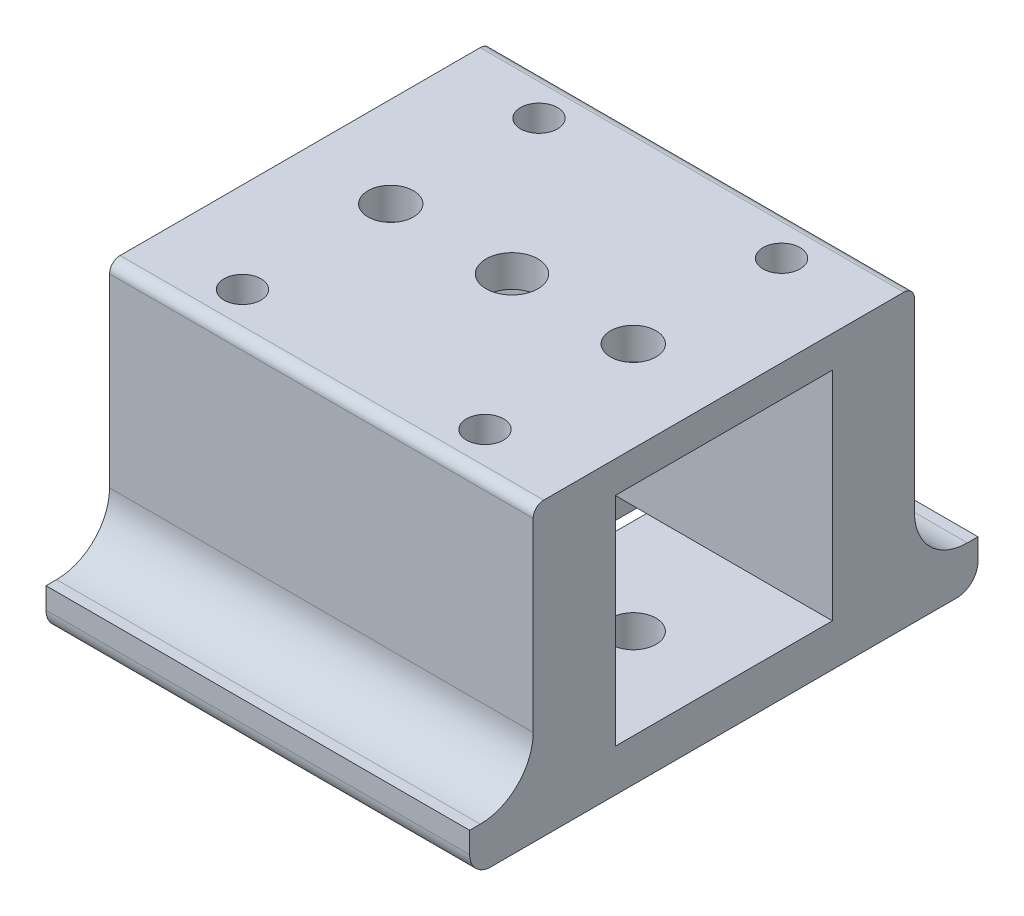
ISO-10303-21;
HEADER;
FILE_DESCRIPTION(('STEP AP214'),'2;1');
FILE_NAME('part.step','',(''),(''),'','','');
FILE_SCHEMA(('AUTOMOTIVE_DESIGN { 1 0 10303 214 1 1 1 1 }'));
ENDSEC;
DATA;
#1=APPLICATION_CONTEXT('core data for automotive mechanical design processes');
#2=APPLICATION_PROTOCOL_DEFINITION('international standard','automotive_design',2000,#1);
#3=PRODUCT_CONTEXT('',#1,'mechanical');
#4=PRODUCT('Part','Part','',(#3));
#5=PRODUCT_RELATED_PRODUCT_CATEGORY('part','',(#4));
#6=PRODUCT_DEFINITION_FORMATION('','',#4);
#7=PRODUCT_DEFINITION_CONTEXT('part definition',#1,'design');
#8=PRODUCT_DEFINITION('design','',#6,#7);
#9=PRODUCT_DEFINITION_SHAPE('','',#8);
#10=(LENGTH_UNIT() NAMED_UNIT(*) SI_UNIT(.MILLI.,.METRE.));
#11=(NAMED_UNIT(*) PLANE_ANGLE_UNIT() SI_UNIT($,.RADIAN.));
#12=(NAMED_UNIT(*) SI_UNIT($,.STERADIAN.) SOLID_ANGLE_UNIT());
#13=UNCERTAINTY_MEASURE_WITH_UNIT(LENGTH_MEASURE(1.E-05),#10,'distance_accuracy_value','');
#14=(GEOMETRIC_REPRESENTATION_CONTEXT(3) GLOBAL_UNCERTAINTY_ASSIGNED_CONTEXT((#13)) GLOBAL_UNIT_ASSIGNED_CONTEXT((#10,
#11,#12)) REPRESENTATION_CONTEXT('',''));
#15=CARTESIAN_POINT('',(0.,0.,0.));
#16=DIRECTION('',(0.,0.,1.));
#17=DIRECTION('',(1.,0.,0.));
#18=AXIS2_PLACEMENT_3D('',#15,#16,#17);
#19=CARTESIAN_POINT('',(0.,26.5,-17.));
#20=DIRECTION('',(-1.,0.,0.));
#21=DIRECTION('',(0.,0.,1.));
#22=AXIS2_PLACEMENT_3D('',#19,#20,#21);
#23=CYLINDRICAL_SURFACE('',#22,1.);
#24=DIRECTION('',(-1.,0.,0.));
#25=VECTOR('',#24,1.);
#26=CARTESIAN_POINT('',(0.,27.5,-17.));
#27=LINE('',#26,#25);
#28=CARTESIAN_POINT('',(20.,27.5,-17.));
#29=VERTEX_POINT('',#28);
#30=CARTESIAN_POINT('',(-20.,27.5,-17.));
#31=VERTEX_POINT('',#30);
#32=EDGE_CURVE('E451',#29,#31,#27,.T.);
#33=ORIENTED_EDGE('',*,*,#32,.F.);
#34=CARTESIAN_POINT('',(20.,26.5,-17.));
#35=DIRECTION('',(-1.,0.,0.));
#36=DIRECTION('',(0.,0.,1.));
#37=AXIS2_PLACEMENT_3D('',#34,#35,#36);
#38=CIRCLE('',#37,1.);
#39=CARTESIAN_POINT('',(20.,26.5,-18.));
#40=VERTEX_POINT('',#39);
#41=EDGE_CURVE('E55',#40,#29,#38,.F.);
#42=ORIENTED_EDGE('',*,*,#41,.F.);
#43=DIRECTION('',(-1.,0.,0.));
#44=VECTOR('',#43,1.);
#45=CARTESIAN_POINT('',(0.,26.5,-18.));
#46=LINE('',#45,#44);
#47=CARTESIAN_POINT('',(-20.,26.5,-18.));
#48=VERTEX_POINT('',#47);
#49=EDGE_CURVE('E455',#48,#40,#46,.F.);
#50=ORIENTED_EDGE('',*,*,#49,.F.);
#51=CARTESIAN_POINT('',(-20.,26.5,-17.));
#52=DIRECTION('',(-1.,0.,0.));
#53=DIRECTION('',(0.,0.,1.));
#54=AXIS2_PLACEMENT_3D('',#51,#52,#53);
#55=CIRCLE('',#54,1.);
#56=EDGE_CURVE('E11',#31,#48,#55,.T.);
#57=ORIENTED_EDGE('',*,*,#56,.F.);
#58=EDGE_LOOP('',(#33,#42,#50,#57));
#59=FACE_BOUND('',#58,.T.);
#60=ADVANCED_FACE('F46',(#59),#23,.T.);
#61=CARTESIAN_POINT('',(0.,26.5,17.));
#62=DIRECTION('',(-1.,0.,0.));
#63=DIRECTION('',(0.,0.,1.));
#64=AXIS2_PLACEMENT_3D('',#61,#62,#63);
#65=CYLINDRICAL_SURFACE('',#64,1.);
#66=DIRECTION('',(1.,0.,0.));
#67=VECTOR('',#66,1.);
#68=CARTESIAN_POINT('',(0.,27.5,17.));
#69=LINE('',#68,#67);
#70=CARTESIAN_POINT('',(-20.,27.5,17.));
#71=VERTEX_POINT('',#70);
#72=CARTESIAN_POINT('',(20.,27.5,17.));
#73=VERTEX_POINT('',#72);
#74=EDGE_CURVE('E436',#71,#73,#69,.T.);
#75=ORIENTED_EDGE('',*,*,#74,.F.);
#76=CARTESIAN_POINT('',(-20.,26.5,17.));
#77=DIRECTION('',(-1.,0.,0.));
#78=DIRECTION('',(0.,0.,1.));
#79=AXIS2_PLACEMENT_3D('',#76,#77,#78);
#80=CIRCLE('',#79,1.);
#81=CARTESIAN_POINT('',(-20.,26.5,18.));
#82=VERTEX_POINT('',#81);
#83=EDGE_CURVE('E444',#82,#71,#80,.T.);
#84=ORIENTED_EDGE('',*,*,#83,.F.);
#85=DIRECTION('',(1.,0.,0.));
#86=VECTOR('',#85,1.);
#87=CARTESIAN_POINT('',(0.,26.5,18.));
#88=LINE('',#87,#86);
#89=CARTESIAN_POINT('',(20.,26.5,18.));
#90=VERTEX_POINT('',#89);
#91=EDGE_CURVE('E440',#90,#82,#88,.F.);
#92=ORIENTED_EDGE('',*,*,#91,.F.);
#93=CARTESIAN_POINT('',(20.,26.5,17.));
#94=DIRECTION('',(-1.,0.,0.));
#95=DIRECTION('',(0.,0.,1.));
#96=AXIS2_PLACEMENT_3D('',#93,#94,#95);
#97=CIRCLE('',#96,1.);
#98=EDGE_CURVE('E448',#73,#90,#97,.F.);
#99=ORIENTED_EDGE('',*,*,#98,.F.);
#100=EDGE_LOOP('',(#75,#84,#92,#99));
#101=FACE_BOUND('',#100,.T.);
#102=ADVANCED_FACE('F551',(#101),#65,.T.);
#103=CARTESIAN_POINT('',(0.,27.5,0.));
#104=DIRECTION('',(0.,1.,0.));
#105=DIRECTION('',(0.,0.,1.));
#106=AXIS2_PLACEMENT_3D('',#103,#104,#105);
#107=PLANE('',#106);
#108=CARTESIAN_POINT('',(0.,27.5,0.));
#109=DIRECTION('',(0.,-1.,0.));
#110=DIRECTION('',(0.,0.,-1.));
#111=AXIS2_PLACEMENT_3D('',#108,#109,#110);
#112=CIRCLE('',#111,2.45);
#113=CARTESIAN_POINT('',(0.,27.5,-2.45));
#114=VERTEX_POINT('',#113);
#115=EDGE_CURVE('E525',#114,#114,#112,.T.);
#116=ORIENTED_EDGE('',*,*,#115,.T.);
#117=EDGE_LOOP('',(#116));
#118=FACE_BOUND('',#117,.T.);
#119=CARTESIAN_POINT('',(11.45,27.5,-14.));
#120=DIRECTION('',(0.,-1.,0.));
#121=DIRECTION('',(0.,0.,-1.));
#122=AXIS2_PLACEMENT_3D('',#119,#120,#121);
#123=CIRCLE('',#122,1.75);
#124=CARTESIAN_POINT('',(11.45,27.5,-15.75));
#125=VERTEX_POINT('',#124);
#126=EDGE_CURVE('E514',#125,#125,#123,.F.);
#127=ORIENTED_EDGE('',*,*,#126,.F.);
#128=EDGE_LOOP('',(#127));
#129=FACE_BOUND('',#128,.T.);
#130=CARTESIAN_POINT('',(11.45,27.5,14.));
#131=DIRECTION('',(0.,-1.,0.));
#132=DIRECTION('',(0.,0.,-1.));
#133=AXIS2_PLACEMENT_3D('',#130,#131,#132);
#134=CIRCLE('',#133,1.75);
#135=CARTESIAN_POINT('',(11.45,27.5,12.25));
#136=VERTEX_POINT('',#135);
#137=EDGE_CURVE('E503',#136,#136,#134,.F.);
#138=ORIENTED_EDGE('',*,*,#137,.F.);
#139=EDGE_LOOP('',(#138));
#140=FACE_BOUND('',#139,.T.);
#141=CARTESIAN_POINT('',(-11.45,27.5,-14.));
#142=DIRECTION('',(0.,-1.,0.));
#143=DIRECTION('',(0.,0.,-1.));
#144=AXIS2_PLACEMENT_3D('',#141,#142,#143);
#145=CIRCLE('',#144,1.75);
#146=CARTESIAN_POINT('',(-11.45,27.5,-15.75));
#147=VERTEX_POINT('',#146);
#148=EDGE_CURVE('E518',#147,#147,#145,.F.);
#149=ORIENTED_EDGE('',*,*,#148,.F.);
#150=EDGE_LOOP('',(#149));
#151=FACE_BOUND('',#150,.T.);
#152=CARTESIAN_POINT('',(-11.45,27.5,14.));
#153=DIRECTION('',(0.,-1.,0.));
#154=DIRECTION('',(0.,0.,-1.));
#155=AXIS2_PLACEMENT_3D('',#152,#153,#154);
#156=CIRCLE('',#155,1.75);
#157=CARTESIAN_POINT('',(-11.45,27.5,12.25));
#158=VERTEX_POINT('',#157);
#159=EDGE_CURVE('E493',#158,#158,#156,.F.);
#160=ORIENTED_EDGE('',*,*,#159,.F.);
#161=EDGE_LOOP('',(#160));
#162=FACE_BOUND('',#161,.T.);
#163=DIRECTION('',(0.,0.,-1.));
#164=VECTOR('',#163,1.);
#165=CARTESIAN_POINT('',(20.,27.5,-18.));
#166=LINE('',#165,#164);
#167=EDGE_CURVE('E464',#73,#29,#166,.T.);
#168=ORIENTED_EDGE('',*,*,#167,.T.);
#169=ORIENTED_EDGE('',*,*,#32,.T.);
#170=DIRECTION('',(0.,0.,1.));
#171=VECTOR('',#170,1.);
#172=CARTESIAN_POINT('',(-20.,27.5,-18.));
#173=LINE('',#172,#171);
#174=EDGE_CURVE('E471',#31,#71,#173,.T.);
#175=ORIENTED_EDGE('',*,*,#174,.T.);
#176=ORIENTED_EDGE('',*,*,#74,.T.);
#177=EDGE_LOOP('',(#168,#169,#175,#176));
#178=FACE_BOUND('',#177,.T.);
#179=CARTESIAN_POINT('',(-11.45,27.5,0.));
#180=DIRECTION('',(0.,-1.,0.));
#181=DIRECTION('',(0.,0.,-1.));
#182=AXIS2_PLACEMENT_3D('',#179,#180,#181);
#183=CIRCLE('',#182,2.15);
#184=CARTESIAN_POINT('',(-11.45,27.5,-2.15));
#185=VERTEX_POINT('',#184);
#186=EDGE_CURVE('E497',#185,#185,#183,.T.);
#187=ORIENTED_EDGE('',*,*,#186,.T.);
#188=EDGE_LOOP('',(#187));
#189=FACE_BOUND('',#188,.T.);
#190=CARTESIAN_POINT('',(11.45,27.5,0.));
#191=DIRECTION('',(0.,-1.,0.));
#192=DIRECTION('',(0.,0.,-1.));
#193=AXIS2_PLACEMENT_3D('',#190,#191,#192);
#194=CIRCLE('',#193,2.15);
#195=CARTESIAN_POINT('',(11.45,27.5,-2.15));
#196=VERTEX_POINT('',#195);
#197=EDGE_CURVE('E502',#196,#196,#194,.T.);
#198=ORIENTED_EDGE('',*,*,#197,.T.);
#199=EDGE_LOOP('',(#198));
#200=FACE_BOUND('',#199,.T.);
#201=ADVANCED_FACE('F467',(#118,#129,#140,#151,#162,#178,#189,#200),#107,.T.);
#202=CARTESIAN_POINT('',(0.,2.,-22.));
#203=DIRECTION('',(-1.,0.,0.));
#204=DIRECTION('',(0.,0.,1.));
#205=AXIS2_PLACEMENT_3D('',#202,#203,#204);
#206=CYLINDRICAL_SURFACE('',#205,2.);
#207=DIRECTION('',(1.,0.,0.));
#208=VECTOR('',#207,1.);
#209=CARTESIAN_POINT('',(0.,0.,-22.));
#210=LINE('',#209,#208);
#211=CARTESIAN_POINT('',(-20.,0.,-22.));
#212=VERTEX_POINT('',#211);
#213=CARTESIAN_POINT('',(20.,0.,-22.));
#214=VERTEX_POINT('',#213);
#215=EDGE_CURVE('E422',#212,#214,#210,.T.);
#216=ORIENTED_EDGE('',*,*,#215,.F.);
#217=CARTESIAN_POINT('',(-20.,2.,-22.));
#218=DIRECTION('',(-1.,0.,0.));
#219=DIRECTION('',(0.,0.,1.));
#220=AXIS2_PLACEMENT_3D('',#217,#218,#219);
#221=CIRCLE('',#220,2.);
#222=CARTESIAN_POINT('',(-20.,2.,-24.));
#223=VERTEX_POINT('',#222);
#224=EDGE_CURVE('E430',#223,#212,#221,.T.);
#225=ORIENTED_EDGE('',*,*,#224,.F.);
#226=DIRECTION('',(1.,0.,0.));
#227=VECTOR('',#226,1.);
#228=CARTESIAN_POINT('',(0.,2.,-24.));
#229=LINE('',#228,#227);
#230=CARTESIAN_POINT('',(20.,2.,-24.));
#231=VERTEX_POINT('',#230);
#232=EDGE_CURVE('E426',#231,#223,#229,.F.);
#233=ORIENTED_EDGE('',*,*,#232,.F.);
#234=CARTESIAN_POINT('',(20.,2.,-22.));
#235=DIRECTION('',(-1.,0.,0.));
#236=DIRECTION('',(0.,0.,1.));
#237=AXIS2_PLACEMENT_3D('',#234,#235,#236);
#238=CIRCLE('',#237,2.);
#239=EDGE_CURVE('E433',#214,#231,#238,.F.);
#240=ORIENTED_EDGE('',*,*,#239,.F.);
#241=EDGE_LOOP('',(#216,#225,#233,#240));
#242=FACE_BOUND('',#241,.T.);
#243=ADVANCED_FACE('F561',(#242),#206,.T.);
#244=CARTESIAN_POINT('',(0.,2.,22.));
#245=DIRECTION('',(-1.,0.,0.));
#246=DIRECTION('',(0.,0.,1.));
#247=AXIS2_PLACEMENT_3D('',#244,#245,#246);
#248=CYLINDRICAL_SURFACE('',#247,2.);
#249=DIRECTION('',(-1.,0.,0.));
#250=VECTOR('',#249,1.);
#251=CARTESIAN_POINT('',(0.,0.,22.));
#252=LINE('',#251,#250);
#253=CARTESIAN_POINT('',(20.,0.,22.));
#254=VERTEX_POINT('',#253);
#255=CARTESIAN_POINT('',(-20.,0.,22.));
#256=VERTEX_POINT('',#255);
#257=EDGE_CURVE('E408',#254,#256,#252,.T.);
#258=ORIENTED_EDGE('',*,*,#257,.F.);
#259=CARTESIAN_POINT('',(20.,2.,22.));
#260=DIRECTION('',(-1.,0.,0.));
#261=DIRECTION('',(0.,0.,1.));
#262=AXIS2_PLACEMENT_3D('',#259,#260,#261);
#263=CIRCLE('',#262,2.);
#264=CARTESIAN_POINT('',(20.,2.,24.));
#265=VERTEX_POINT('',#264);
#266=EDGE_CURVE('E416',#265,#254,#263,.F.);
#267=ORIENTED_EDGE('',*,*,#266,.F.);
#268=DIRECTION('',(-1.,0.,0.));
#269=VECTOR('',#268,1.);
#270=CARTESIAN_POINT('',(0.,2.,24.));
#271=LINE('',#270,#269);
#272=CARTESIAN_POINT('',(-20.,2.,24.));
#273=VERTEX_POINT('',#272);
#274=EDGE_CURVE('E412',#273,#265,#271,.F.);
#275=ORIENTED_EDGE('',*,*,#274,.F.);
#276=CARTESIAN_POINT('',(-20.,2.,22.));
#277=DIRECTION('',(-1.,0.,0.));
#278=DIRECTION('',(0.,0.,1.));
#279=AXIS2_PLACEMENT_3D('',#276,#277,#278);
#280=CIRCLE('',#279,2.);
#281=EDGE_CURVE('E419',#256,#273,#280,.T.);
#282=ORIENTED_EDGE('',*,*,#281,.F.);
#283=EDGE_LOOP('',(#258,#267,#275,#282));
#284=FACE_BOUND('',#283,.T.);
#285=ADVANCED_FACE('F566',(#284),#248,.T.);
#286=CARTESIAN_POINT('',(0.,9.,23.));
#287=DIRECTION('',(1.,0.,0.));
#288=DIRECTION('',(0.,0.,-1.));
#289=AXIS2_PLACEMENT_3D('',#286,#287,#288);
#290=CYLINDRICAL_SURFACE('',#289,5.);
#291=DIRECTION('',(1.,0.,0.));
#292=VECTOR('',#291,1.);
#293=CARTESIAN_POINT('',(0.,9.,18.));
#294=LINE('',#293,#292);
#295=CARTESIAN_POINT('',(-20.,9.,18.));
#296=VERTEX_POINT('',#295);
#297=CARTESIAN_POINT('',(20.,9.,18.));
#298=VERTEX_POINT('',#297);
#299=EDGE_CURVE('E393',#296,#298,#294,.T.);
#300=ORIENTED_EDGE('',*,*,#299,.F.);
#301=CARTESIAN_POINT('',(-20.,9.,23.));
#302=DIRECTION('',(-1.,0.,0.));
#303=DIRECTION('',(0.,0.,1.));
#304=AXIS2_PLACEMENT_3D('',#301,#302,#303);
#305=CIRCLE('',#304,5.);
#306=CARTESIAN_POINT('',(-20.,4.,23.));
#307=VERTEX_POINT('',#306);
#308=EDGE_CURVE('E401',#296,#307,#305,.T.);
#309=ORIENTED_EDGE('',*,*,#308,.T.);
#310=DIRECTION('',(1.,0.,0.));
#311=VECTOR('',#310,1.);
#312=CARTESIAN_POINT('',(0.,4.,23.));
#313=LINE('',#312,#311);
#314=CARTESIAN_POINT('',(20.,4.,23.));
#315=VERTEX_POINT('',#314);
#316=EDGE_CURVE('E397',#315,#307,#313,.F.);
#317=ORIENTED_EDGE('',*,*,#316,.F.);
#318=CARTESIAN_POINT('',(20.,9.,23.));
#319=DIRECTION('',(-1.,0.,0.));
#320=DIRECTION('',(0.,0.,1.));
#321=AXIS2_PLACEMENT_3D('',#318,#319,#320);
#322=CIRCLE('',#321,5.);
#323=EDGE_CURVE('E404',#315,#298,#322,.F.);
#324=ORIENTED_EDGE('',*,*,#323,.T.);
#325=EDGE_LOOP('',(#300,#309,#317,#324));
#326=FACE_BOUND('',#325,.T.);
#327=ADVANCED_FACE('F570',(#326),#290,.F.);
#328=CARTESIAN_POINT('',(0.,9.,-23.));
#329=DIRECTION('',(1.,0.,0.));
#330=DIRECTION('',(0.,0.,-1.));
#331=AXIS2_PLACEMENT_3D('',#328,#329,#330);
#332=CYLINDRICAL_SURFACE('',#331,5.);
#333=DIRECTION('',(-1.,0.,0.));
#334=VECTOR('',#333,1.);
#335=CARTESIAN_POINT('',(0.,9.,-18.));
#336=LINE('',#335,#334);
#337=CARTESIAN_POINT('',(20.,9.,-18.));
#338=VERTEX_POINT('',#337);
#339=CARTESIAN_POINT('',(-20.,9.,-18.));
#340=VERTEX_POINT('',#339);
#341=EDGE_CURVE('E378',#338,#340,#336,.T.);
#342=ORIENTED_EDGE('',*,*,#341,.F.);
#343=CARTESIAN_POINT('',(20.,9.,-23.));
#344=DIRECTION('',(-1.,0.,0.));
#345=DIRECTION('',(0.,0.,1.));
#346=AXIS2_PLACEMENT_3D('',#343,#344,#345);
#347=CIRCLE('',#346,5.);
#348=CARTESIAN_POINT('',(20.,4.,-23.));
#349=VERTEX_POINT('',#348);
#350=EDGE_CURVE('E386',#338,#349,#347,.F.);
#351=ORIENTED_EDGE('',*,*,#350,.T.);
#352=DIRECTION('',(-1.,0.,0.));
#353=VECTOR('',#352,1.);
#354=CARTESIAN_POINT('',(0.,4.,-23.));
#355=LINE('',#354,#353);
#356=CARTESIAN_POINT('',(-20.,4.,-23.));
#357=VERTEX_POINT('',#356);
#358=EDGE_CURVE('E382',#357,#349,#355,.F.);
#359=ORIENTED_EDGE('',*,*,#358,.F.);
#360=CARTESIAN_POINT('',(-20.,9.,-23.));
#361=DIRECTION('',(-1.,0.,0.));
#362=DIRECTION('',(0.,0.,1.));
#363=AXIS2_PLACEMENT_3D('',#360,#361,#362);
#364=CIRCLE('',#363,5.);
#365=EDGE_CURVE('E389',#357,#340,#364,.T.);
#366=ORIENTED_EDGE('',*,*,#365,.T.);
#367=EDGE_LOOP('',(#342,#351,#359,#366));
#368=FACE_BOUND('',#367,.T.);
#369=ADVANCED_FACE('F574',(#368),#332,.F.);
#370=CARTESIAN_POINT('',(0.,4.,0.));
#371=DIRECTION('',(0.,1.,0.));
#372=DIRECTION('',(0.,0.,1.));
#373=AXIS2_PLACEMENT_3D('',#370,#371,#372);
#374=PLANE('',#373);
#375=DIRECTION('',(0.,0.,-1.));
#376=VECTOR('',#375,1.);
#377=CARTESIAN_POINT('',(-20.,4.,0.));
#378=LINE('',#377,#376);
#379=CARTESIAN_POINT('',(-20.,4.,-24.));
#380=VERTEX_POINT('',#379);
#381=EDGE_CURVE('E307',#357,#380,#378,.T.);
#382=ORIENTED_EDGE('',*,*,#381,.F.);
#383=ORIENTED_EDGE('',*,*,#358,.T.);
#384=DIRECTION('',(0.,0.,-1.));
#385=VECTOR('',#384,1.);
#386=CARTESIAN_POINT('',(20.,4.,0.));
#387=LINE('',#386,#385);
#388=CARTESIAN_POINT('',(20.,4.,-24.));
#389=VERTEX_POINT('',#388);
#390=EDGE_CURVE('E297',#349,#389,#387,.T.);
#391=ORIENTED_EDGE('',*,*,#390,.T.);
#392=DIRECTION('',(1.,0.,0.));
#393=VECTOR('',#392,1.);
#394=CARTESIAN_POINT('',(0.,4.,-24.));
#395=LINE('',#394,#393);
#396=EDGE_CURVE('E302',#380,#389,#395,.T.);
#397=ORIENTED_EDGE('',*,*,#396,.F.);
#398=EDGE_LOOP('',(#382,#383,#391,#397));
#399=FACE_BOUND('',#398,.T.);
#400=ADVANCED_FACE('F578',(#399),#374,.T.);
#401=CARTESIAN_POINT('',(-11.45,4.,0.));
#402=DIRECTION('',(0.,1.,0.));
#403=DIRECTION('',(0.,0.,1.));
#404=AXIS2_PLACEMENT_3D('',#401,#402,#403);
#405=CIRCLE('',#404,2.15);
#406=CARTESIAN_POINT('',(-11.45,4.,2.15));
#407=VERTEX_POINT('',#406);
#408=EDGE_CURVE('E485',#407,#407,#405,.T.);
#409=ORIENTED_EDGE('',*,*,#408,.F.);
#410=EDGE_LOOP('',(#409));
#411=FACE_BOUND('',#410,.T.);
#412=DIRECTION('',(1.,0.,0.));
#413=VECTOR('',#412,1.);
#414=CARTESIAN_POINT('',(0.,4.,-10.25));
#415=LINE('',#414,#413);
#416=CARTESIAN_POINT('',(-20.,4.,-10.25));
#417=VERTEX_POINT('',#416);
#418=CARTESIAN_POINT('',(-2.44999999999999,4.,-10.25));
#419=VERTEX_POINT('',#418);
#420=EDGE_CURVE('E237',#417,#419,#415,.T.);
#421=ORIENTED_EDGE('',*,*,#420,.F.);
#422=CARTESIAN_POINT('',(-20.,4.,10.25));
#423=VERTEX_POINT('',#422);
#424=EDGE_CURVE('E224',#423,#417,#378,.T.);
#425=ORIENTED_EDGE('',*,*,#424,.F.);
#426=DIRECTION('',(1.,0.,0.));
#427=VECTOR('',#426,1.);
#428=CARTESIAN_POINT('',(0.,4.,10.25));
#429=LINE('',#428,#427);
#430=CARTESIAN_POINT('',(-2.44999999999999,4.,10.25));
#431=VERTEX_POINT('',#430);
#432=EDGE_CURVE('E255',#423,#431,#429,.T.);
#433=ORIENTED_EDGE('',*,*,#432,.T.);
#434=DIRECTION('',(0.,0.,-1.));
#435=VECTOR('',#434,1.);
#436=CARTESIAN_POINT('',(-2.44999999999999,4.,0.));
#437=LINE('',#436,#435);
#438=EDGE_CURVE('E293',#431,#419,#437,.T.);
#439=ORIENTED_EDGE('',*,*,#438,.T.);
#440=EDGE_LOOP('',(#421,#425,#433,#439));
#441=FACE_BOUND('',#440,.T.);
#442=ADVANCED_FACE('F781',(#411,#441),#374,.T.);
#443=CARTESIAN_POINT('',(11.45,4.,0.));
#444=DIRECTION('',(0.,1.,0.));
#445=DIRECTION('',(0.,0.,1.));
#446=AXIS2_PLACEMENT_3D('',#443,#444,#445);
#447=CIRCLE('',#446,2.15);
#448=CARTESIAN_POINT('',(11.45,4.,2.15));
#449=VERTEX_POINT('',#448);
#450=EDGE_CURVE('E218',#449,#449,#447,.T.);
#451=ORIENTED_EDGE('',*,*,#450,.F.);
#452=EDGE_LOOP('',(#451));
#453=FACE_BOUND('',#452,.T.);
#454=CARTESIAN_POINT('',(2.45,4.,-10.25));
#455=VERTEX_POINT('',#454);
#456=CARTESIAN_POINT('',(20.,4.,-10.25));
#457=VERTEX_POINT('',#456);
#458=EDGE_CURVE('E244',#455,#457,#415,.T.);
#459=ORIENTED_EDGE('',*,*,#458,.F.);
#460=DIRECTION('',(0.,0.,-1.));
#461=VECTOR('',#460,1.);
#462=CARTESIAN_POINT('',(2.45,4.,0.));
#463=LINE('',#462,#461);
#464=CARTESIAN_POINT('',(2.45,4.,10.25));
#465=VERTEX_POINT('',#464);
#466=EDGE_CURVE('E283',#465,#455,#463,.T.);
#467=ORIENTED_EDGE('',*,*,#466,.F.);
#468=CARTESIAN_POINT('',(20.,4.,10.25));
#469=VERTEX_POINT('',#468);
#470=EDGE_CURVE('E259',#465,#469,#429,.T.);
#471=ORIENTED_EDGE('',*,*,#470,.T.);
#472=EDGE_CURVE('E303',#469,#457,#387,.T.);
#473=ORIENTED_EDGE('',*,*,#472,.T.);
#474=EDGE_LOOP('',(#459,#467,#471,#473));
#475=FACE_BOUND('',#474,.T.);
#476=ADVANCED_FACE('F610',(#453,#475),#374,.T.);
#477=CARTESIAN_POINT('',(0.,4.,24.));
#478=DIRECTION('',(0.,0.,-1.));
#479=DIRECTION('',(-1.,0.,0.));
#480=AXIS2_PLACEMENT_3D('',#477,#478,#479);
#481=PLANE('',#480);
#482=DIRECTION('',(0.,-1.,0.));
#483=VECTOR('',#482,1.);
#484=CARTESIAN_POINT('',(-20.,4.,24.));
#485=LINE('',#484,#483);
#486=CARTESIAN_POINT('',(-20.,4.,24.));
#487=VERTEX_POINT('',#486);
#488=EDGE_CURVE('E349',#487,#273,#485,.T.);
#489=ORIENTED_EDGE('',*,*,#488,.T.);
#490=ORIENTED_EDGE('',*,*,#274,.T.);
#491=DIRECTION('',(0.,-1.,0.));
#492=VECTOR('',#491,1.);
#493=CARTESIAN_POINT('',(20.,4.,24.));
#494=LINE('',#493,#492);
#495=CARTESIAN_POINT('',(20.,4.,24.));
#496=VERTEX_POINT('',#495);
#497=EDGE_CURVE('E362',#496,#265,#494,.T.);
#498=ORIENTED_EDGE('',*,*,#497,.F.);
#499=DIRECTION('',(1.,0.,0.));
#500=VECTOR('',#499,1.);
#501=CARTESIAN_POINT('',(0.,4.,24.));
#502=LINE('',#501,#500);
#503=EDGE_CURVE('E292',#487,#496,#502,.T.);
#504=ORIENTED_EDGE('',*,*,#503,.F.);
#505=EDGE_LOOP('',(#489,#490,#498,#504));
#506=FACE_BOUND('',#505,.T.);
#507=ADVANCED_FACE('F607',(#506),#481,.F.);
#508=CARTESIAN_POINT('',(20.,4.,0.));
#509=DIRECTION('',(-1.,0.,0.));
#510=DIRECTION('',(0.,0.,1.));
#511=AXIS2_PLACEMENT_3D('',#508,#509,#510);
#512=PLANE('',#511);
#513=DIRECTION('',(0.,-1.,0.));
#514=VECTOR('',#513,1.);
#515=CARTESIAN_POINT('',(20.,24.5,10.25));
#516=LINE('',#515,#514);
#517=CARTESIAN_POINT('',(20.,24.5,10.25));
#518=VERTEX_POINT('',#517);
#519=EDGE_CURVE('E262',#518,#469,#516,.T.);
#520=ORIENTED_EDGE('',*,*,#519,.F.);
#521=DIRECTION('',(0.,0.,-1.));
#522=VECTOR('',#521,1.);
#523=CARTESIAN_POINT('',(20.,24.5,-18.));
#524=LINE('',#523,#522);
#525=CARTESIAN_POINT('',(20.,24.5,-10.25));
#526=VERTEX_POINT('',#525);
#527=EDGE_CURVE('E217',#518,#526,#524,.T.);
#528=ORIENTED_EDGE('',*,*,#527,.T.);
#529=DIRECTION('',(0.,-1.,0.));
#530=VECTOR('',#529,1.);
#531=CARTESIAN_POINT('',(20.,24.5,-10.25));
#532=LINE('',#531,#530);
#533=EDGE_CURVE('E229',#526,#457,#532,.T.);
#534=ORIENTED_EDGE('',*,*,#533,.T.);
#535=ORIENTED_EDGE('',*,*,#472,.F.);
#536=EDGE_LOOP('',(#520,#528,#534,#535));
#537=FACE_BOUND('',#536,.T.);
#538=DIRECTION('',(0.,-1.,0.));
#539=VECTOR('',#538,1.);
#540=CARTESIAN_POINT('',(20.,24.5,-18.));
#541=LINE('',#540,#539);
#542=EDGE_CURVE('E236',#40,#338,#541,.T.);
#543=ORIENTED_EDGE('',*,*,#542,.F.);
#544=ORIENTED_EDGE('',*,*,#41,.T.);
#545=ORIENTED_EDGE('',*,*,#167,.F.);
#546=ORIENTED_EDGE('',*,*,#98,.T.);
#547=DIRECTION('',(0.,-1.,0.));
#548=VECTOR('',#547,1.);
#549=CARTESIAN_POINT('',(20.,24.5,18.));
#550=LINE('',#549,#548);
#551=EDGE_CURVE('E266',#90,#298,#550,.T.);
#552=ORIENTED_EDGE('',*,*,#551,.T.);
#553=ORIENTED_EDGE('',*,*,#323,.F.);
#554=EDGE_CURVE('E298',#496,#315,#387,.T.);
#555=ORIENTED_EDGE('',*,*,#554,.F.);
#556=ORIENTED_EDGE('',*,*,#497,.T.);
#557=ORIENTED_EDGE('',*,*,#266,.T.);
#558=DIRECTION('',(0.,0.,-1.));
#559=VECTOR('',#558,1.);
#560=CARTESIAN_POINT('',(20.,0.,0.));
#561=LINE('',#560,#559);
#562=EDGE_CURVE('E334',#254,#214,#561,.T.);
#563=ORIENTED_EDGE('',*,*,#562,.T.);
#564=ORIENTED_EDGE('',*,*,#239,.T.);
#565=DIRECTION('',(0.,-1.,0.));
#566=VECTOR('',#565,1.);
#567=CARTESIAN_POINT('',(20.,4.,-24.));
#568=LINE('',#567,#566);
#569=EDGE_CURVE('E358',#389,#231,#568,.T.);
#570=ORIENTED_EDGE('',*,*,#569,.F.);
#571=ORIENTED_EDGE('',*,*,#390,.F.);
#572=ORIENTED_EDGE('',*,*,#350,.F.);
#573=EDGE_LOOP('',(#543,#544,#545,#546,#552,#553,#555,#556,#557,#563,#564,#570,#571,#572));
#574=FACE_BOUND('',#573,.T.);
#575=ADVANCED_FACE('F462',(#537,#574),#512,.F.);
#576=CARTESIAN_POINT('',(0.,4.,-24.));
#577=DIRECTION('',(0.,0.,-1.));
#578=DIRECTION('',(-1.,0.,0.));
#579=AXIS2_PLACEMENT_3D('',#576,#577,#578);
#580=PLANE('',#579);
#581=ORIENTED_EDGE('',*,*,#569,.T.);
#582=ORIENTED_EDGE('',*,*,#232,.T.);
#583=DIRECTION('',(0.,-1.,0.));
#584=VECTOR('',#583,1.);
#585=CARTESIAN_POINT('',(-20.,4.,-24.));
#586=LINE('',#585,#584);
#587=EDGE_CURVE('E353',#380,#223,#586,.T.);
#588=ORIENTED_EDGE('',*,*,#587,.F.);
#589=ORIENTED_EDGE('',*,*,#396,.T.);
#590=EDGE_LOOP('',(#581,#582,#588,#589));
#591=FACE_BOUND('',#590,.T.);
#592=ADVANCED_FACE('F590',(#591),#580,.T.);
#593=CARTESIAN_POINT('',(0.,4.,-15.5));
#594=DIRECTION('',(0.,-1.,0.));
#595=DIRECTION('',(0.,0.,-1.));
#596=AXIS2_PLACEMENT_3D('',#593,#594,#595);
#597=CYLINDRICAL_SURFACE('',#596,2.45);
#598=CARTESIAN_POINT('',(0.,0.,-15.5));
#599=DIRECTION('',(0.,1.,0.));
#600=DIRECTION('',(0.,0.,1.));
#601=AXIS2_PLACEMENT_3D('',#598,#599,#600);
#602=CIRCLE('',#601,2.45);
#603=CARTESIAN_POINT('',(2.45,0.,-15.5));
#604=VERTEX_POINT('',#603);
#605=CARTESIAN_POINT('',(-2.44999999999999,0.,-15.5));
#606=VERTEX_POINT('',#605);
#607=EDGE_CURVE('E316',#604,#606,#602,.T.);
#608=ORIENTED_EDGE('',*,*,#607,.F.);
#609=DIRECTION('',(0.,-1.,0.));
#610=VECTOR('',#609,1.);
#611=CARTESIAN_POINT('',(2.45,4.,-15.5));
#612=LINE('',#611,#610);
#613=CARTESIAN_POINT('',(2.45,4.,-15.5));
#614=VERTEX_POINT('',#613);
#615=EDGE_CURVE('E354',#614,#604,#612,.T.);
#616=ORIENTED_EDGE('',*,*,#615,.F.);
#617=CARTESIAN_POINT('',(0.,4.,-15.5));
#618=DIRECTION('',(0.,1.,0.));
#619=DIRECTION('',(0.,0.,1.));
#620=AXIS2_PLACEMENT_3D('',#617,#618,#619);
#621=CIRCLE('',#620,2.45);
#622=CARTESIAN_POINT('',(-2.44999999999999,4.,-15.5));
#623=VERTEX_POINT('',#622);
#624=EDGE_CURVE('E272',#614,#623,#621,.T.);
#625=ORIENTED_EDGE('',*,*,#624,.T.);
#626=DIRECTION('',(0.,-1.,0.));
#627=VECTOR('',#626,1.);
#628=CARTESIAN_POINT('',(-2.44999999999999,4.,-15.5));
#629=LINE('',#628,#627);
#630=EDGE_CURVE('E312',#623,#606,#629,.T.);
#631=ORIENTED_EDGE('',*,*,#630,.T.);
#632=EDGE_LOOP('',(#608,#616,#625,#631));
#633=FACE_BOUND('',#632,.T.);
#634=ADVANCED_FACE('F586',(#633),#597,.F.);
#635=CARTESIAN_POINT('',(2.45,4.,0.));
#636=DIRECTION('',(-1.,0.,0.));
#637=DIRECTION('',(0.,0.,1.));
#638=AXIS2_PLACEMENT_3D('',#635,#636,#637);
#639=PLANE('',#638);
#640=ORIENTED_EDGE('',*,*,#615,.T.);
#641=DIRECTION('',(0.,0.,-1.));
#642=VECTOR('',#641,1.);
#643=CARTESIAN_POINT('',(2.45,0.,0.));
#644=LINE('',#643,#642);
#645=CARTESIAN_POINT('',(2.45,0.,15.5));
#646=VERTEX_POINT('',#645);
#647=EDGE_CURVE('E320',#646,#604,#644,.T.);
#648=ORIENTED_EDGE('',*,*,#647,.F.);
#649=DIRECTION('',(0.,-1.,0.));
#650=VECTOR('',#649,1.);
#651=CARTESIAN_POINT('',(2.45,4.,15.5));
#652=LINE('',#651,#650);
#653=CARTESIAN_POINT('',(2.45,4.,15.5));
#654=VERTEX_POINT('',#653);
#655=EDGE_CURVE('E372',#654,#646,#652,.T.);
#656=ORIENTED_EDGE('',*,*,#655,.F.);
#657=EDGE_CURVE('E278',#654,#465,#463,.T.);
#658=ORIENTED_EDGE('',*,*,#657,.T.);
#659=ORIENTED_EDGE('',*,*,#466,.T.);
#660=EDGE_CURVE('E276',#455,#614,#463,.T.);
#661=ORIENTED_EDGE('',*,*,#660,.T.);
#662=EDGE_LOOP('',(#640,#648,#656,#658,#659,#661));
#663=FACE_BOUND('',#662,.T.);
#664=ADVANCED_FACE('F589',(#663),#639,.T.);
#665=CARTESIAN_POINT('',(0.,4.,15.5));
#666=DIRECTION('',(0.,-1.,0.));
#667=DIRECTION('',(0.,0.,-1.));
#668=AXIS2_PLACEMENT_3D('',#665,#666,#667);
#669=CYLINDRICAL_SURFACE('',#668,2.45);
#670=CARTESIAN_POINT('',(0.,0.,15.5));
#671=DIRECTION('',(0.,1.,0.));
#672=DIRECTION('',(0.,0.,1.));
#673=AXIS2_PLACEMENT_3D('',#670,#671,#672);
#674=CIRCLE('',#673,2.45);
#675=CARTESIAN_POINT('',(-2.44999999999999,0.,15.5));
#676=VERTEX_POINT('',#675);
#677=EDGE_CURVE('E323',#676,#646,#674,.T.);
#678=ORIENTED_EDGE('',*,*,#677,.F.);
#679=DIRECTION('',(0.,-1.,0.));
#680=VECTOR('',#679,1.);
#681=CARTESIAN_POINT('',(-2.44999999999999,4.,15.5));
#682=LINE('',#681,#680);
#683=CARTESIAN_POINT('',(-2.44999999999999,4.,15.5));
#684=VERTEX_POINT('',#683);
#685=EDGE_CURVE('E369',#684,#676,#682,.T.);
#686=ORIENTED_EDGE('',*,*,#685,.F.);
#687=CARTESIAN_POINT('',(0.,4.,15.5));
#688=DIRECTION('',(0.,1.,0.));
#689=DIRECTION('',(0.,0.,1.));
#690=AXIS2_PLACEMENT_3D('',#687,#688,#689);
#691=CIRCLE('',#690,2.45);
#692=EDGE_CURVE('E282',#684,#654,#691,.T.);
#693=ORIENTED_EDGE('',*,*,#692,.T.);
#694=ORIENTED_EDGE('',*,*,#655,.T.);
#695=EDGE_LOOP('',(#678,#686,#693,#694));
#696=FACE_BOUND('',#695,.T.);
#697=ADVANCED_FACE('F594',(#696),#669,.F.);
#698=CARTESIAN_POINT('',(-11.45,4.,14.));
#699=DIRECTION('',(0.,-1.,0.));
#700=DIRECTION('',(0.,0.,-1.));
#701=AXIS2_PLACEMENT_3D('',#698,#699,#700);
#702=CYLINDRICAL_SURFACE('',#701,1.75);
#703=CARTESIAN_POINT('',(-11.45,0.,14.));
#704=DIRECTION('',(0.,1.,0.));
#705=DIRECTION('',(0.,0.,1.));
#706=AXIS2_PLACEMENT_3D('',#703,#704,#705);
#707=CIRCLE('',#706,1.75);
#708=CARTESIAN_POINT('',(-11.45,0.,15.75));
#709=VERTEX_POINT('',#708);
#710=EDGE_CURVE('E342',#709,#709,#707,.T.);
#711=ORIENTED_EDGE('',*,*,#710,.F.);
#712=EDGE_LOOP('',(#711));
#713=FACE_BOUND('',#712,.T.);
#714=ORIENTED_EDGE('',*,*,#159,.T.);
#715=EDGE_LOOP('',(#714));
#716=FACE_BOUND('',#715,.T.);
#717=ADVANCED_FACE('F598',(#713,#716),#702,.F.);
#718=CARTESIAN_POINT('',(-20.,4.,0.));
#719=DIRECTION('',(-1.,0.,0.));
#720=DIRECTION('',(0.,0.,1.));
#721=AXIS2_PLACEMENT_3D('',#718,#719,#720);
#722=PLANE('',#721);
#723=ORIENTED_EDGE('',*,*,#174,.F.);
#724=ORIENTED_EDGE('',*,*,#56,.T.);
#725=DIRECTION('',(0.,-1.,0.));
#726=VECTOR('',#725,1.);
#727=CARTESIAN_POINT('',(-20.,24.5,-18.));
#728=LINE('',#727,#726);
#729=EDGE_CURVE('E228',#48,#340,#728,.T.);
#730=ORIENTED_EDGE('',*,*,#729,.T.);
#731=ORIENTED_EDGE('',*,*,#365,.F.);
#732=ORIENTED_EDGE('',*,*,#381,.T.);
#733=ORIENTED_EDGE('',*,*,#587,.T.);
#734=ORIENTED_EDGE('',*,*,#224,.T.);
#735=DIRECTION('',(0.,0.,-1.));
#736=VECTOR('',#735,1.);
#737=CARTESIAN_POINT('',(-20.,0.,0.));
#738=LINE('',#737,#736);
#739=EDGE_CURVE('E338',#256,#212,#738,.T.);
#740=ORIENTED_EDGE('',*,*,#739,.F.);
#741=ORIENTED_EDGE('',*,*,#281,.T.);
#742=ORIENTED_EDGE('',*,*,#488,.F.);
#743=EDGE_CURVE('E308',#487,#307,#378,.T.);
#744=ORIENTED_EDGE('',*,*,#743,.T.);
#745=ORIENTED_EDGE('',*,*,#308,.F.);
#746=DIRECTION('',(0.,-1.,0.));
#747=VECTOR('',#746,1.);
#748=CARTESIAN_POINT('',(-20.,24.5,18.));
#749=LINE('',#748,#747);
#750=EDGE_CURVE('E269',#82,#296,#749,.T.);
#751=ORIENTED_EDGE('',*,*,#750,.F.);
#752=ORIENTED_EDGE('',*,*,#83,.T.);
#753=EDGE_LOOP('',(#723,#724,#730,#731,#732,#733,#734,#740,#741,#742,#744,#745,#751,#752));
#754=FACE_BOUND('',#753,.T.);
#755=DIRECTION('',(0.,0.,1.));
#756=VECTOR('',#755,1.);
#757=CARTESIAN_POINT('',(-20.,24.5,-18.));
#758=LINE('',#757,#756);
#759=CARTESIAN_POINT('',(-20.,24.5,-10.25));
#760=VERTEX_POINT('',#759);
#761=CARTESIAN_POINT('',(-20.,24.5,10.25));
#762=VERTEX_POINT('',#761);
#763=EDGE_CURVE('E205',#760,#762,#758,.T.);
#764=ORIENTED_EDGE('',*,*,#763,.T.);
#765=DIRECTION('',(0.,-1.,0.));
#766=VECTOR('',#765,1.);
#767=CARTESIAN_POINT('',(-20.,24.5,10.25));
#768=LINE('',#767,#766);
#769=EDGE_CURVE('E254',#762,#423,#768,.T.);
#770=ORIENTED_EDGE('',*,*,#769,.T.);
#771=ORIENTED_EDGE('',*,*,#424,.T.);
#772=DIRECTION('',(0.,-1.,0.));
#773=VECTOR('',#772,1.);
#774=CARTESIAN_POINT('',(-20.,24.5,-10.25));
#775=LINE('',#774,#773);
#776=EDGE_CURVE('E222',#760,#417,#775,.T.);
#777=ORIENTED_EDGE('',*,*,#776,.F.);
#778=EDGE_LOOP('',(#764,#770,#771,#777));
#779=FACE_BOUND('',#778,.T.);
#780=ADVANCED_FACE('F223',(#754,#779),#722,.T.);
#781=CARTESIAN_POINT('',(-11.45,4.,-14.));
#782=DIRECTION('',(0.,-1.,0.));
#783=DIRECTION('',(0.,0.,-1.));
#784=AXIS2_PLACEMENT_3D('',#781,#782,#783);
#785=CYLINDRICAL_SURFACE('',#784,1.75);
#786=CARTESIAN_POINT('',(-11.45,0.,-14.));
#787=DIRECTION('',(0.,1.,0.));
#788=DIRECTION('',(0.,0.,1.));
#789=AXIS2_PLACEMENT_3D('',#786,#787,#788);
#790=CIRCLE('',#789,1.75);
#791=CARTESIAN_POINT('',(-11.45,0.,-12.25));
#792=VERTEX_POINT('',#791);
#793=EDGE_CURVE('E330',#792,#792,#790,.F.);
#794=ORIENTED_EDGE('',*,*,#793,.T.);
#795=EDGE_LOOP('',(#794));
#796=FACE_BOUND('',#795,.T.);
#797=ORIENTED_EDGE('',*,*,#148,.T.);
#798=EDGE_LOOP('',(#797));
#799=FACE_BOUND('',#798,.T.);
#800=ADVANCED_FACE('F602',(#796,#799),#785,.F.);
#801=CARTESIAN_POINT('',(-2.44999999999999,4.,0.));
#802=DIRECTION('',(-1.,0.,0.));
#803=DIRECTION('',(0.,0.,1.));
#804=AXIS2_PLACEMENT_3D('',#801,#802,#803);
#805=PLANE('',#804);
#806=EDGE_CURVE('E287',#419,#623,#437,.T.);
#807=ORIENTED_EDGE('',*,*,#806,.F.);
#808=ORIENTED_EDGE('',*,*,#438,.F.);
#809=EDGE_CURVE('E288',#684,#431,#437,.T.);
#810=ORIENTED_EDGE('',*,*,#809,.F.);
#811=ORIENTED_EDGE('',*,*,#685,.T.);
#812=DIRECTION('',(0.,0.,-1.));
#813=VECTOR('',#812,1.);
#814=CARTESIAN_POINT('',(-2.44999999999999,0.,0.));
#815=LINE('',#814,#813);
#816=EDGE_CURVE('E327',#676,#606,#815,.T.);
#817=ORIENTED_EDGE('',*,*,#816,.T.);
#818=ORIENTED_EDGE('',*,*,#630,.F.);
#819=EDGE_LOOP('',(#807,#808,#810,#811,#817,#818));
#820=FACE_BOUND('',#819,.T.);
#821=ADVANCED_FACE('F584',(#820),#805,.F.);
#822=CARTESIAN_POINT('',(11.45,4.,-14.));
#823=DIRECTION('',(0.,-1.,0.));
#824=DIRECTION('',(0.,0.,-1.));
#825=AXIS2_PLACEMENT_3D('',#822,#823,#824);
#826=CYLINDRICAL_SURFACE('',#825,1.75);
#827=CARTESIAN_POINT('',(11.45,0.,-14.));
#828=DIRECTION('',(0.,1.,0.));
#829=DIRECTION('',(0.,0.,1.));
#830=AXIS2_PLACEMENT_3D('',#827,#828,#829);
#831=CIRCLE('',#830,1.75);
#832=CARTESIAN_POINT('',(11.45,0.,-12.25));
#833=VERTEX_POINT('',#832);
#834=EDGE_CURVE('E251',#833,#833,#831,.T.);
#835=ORIENTED_EDGE('',*,*,#834,.F.);
#836=EDGE_LOOP('',(#835));
#837=FACE_BOUND('',#836,.T.);
#838=ORIENTED_EDGE('',*,*,#126,.T.);
#839=EDGE_LOOP('',(#838));
#840=FACE_BOUND('',#839,.T.);
#841=ADVANCED_FACE('F580',(#837,#840),#826,.F.);
#842=CARTESIAN_POINT('',(11.45,4.,14.));
#843=DIRECTION('',(0.,-1.,0.));
#844=DIRECTION('',(0.,0.,-1.));
#845=AXIS2_PLACEMENT_3D('',#842,#843,#844);
#846=CYLINDRICAL_SURFACE('',#845,1.75);
#847=CARTESIAN_POINT('',(11.45,0.,14.));
#848=DIRECTION('',(0.,1.,0.));
#849=DIRECTION('',(0.,0.,1.));
#850=AXIS2_PLACEMENT_3D('',#847,#848,#849);
#851=CIRCLE('',#850,1.75);
#852=CARTESIAN_POINT('',(11.45,0.,15.75));
#853=VERTEX_POINT('',#852);
#854=EDGE_CURVE('E277',#853,#853,#851,.F.);
#855=ORIENTED_EDGE('',*,*,#854,.T.);
#856=EDGE_LOOP('',(#855));
#857=FACE_BOUND('',#856,.T.);
#858=ORIENTED_EDGE('',*,*,#137,.T.);
#859=EDGE_LOOP('',(#858));
#860=FACE_BOUND('',#859,.T.);
#861=ADVANCED_FACE('F583',(#857,#860),#846,.F.);
#862=ORIENTED_EDGE('',*,*,#554,.T.);
#863=ORIENTED_EDGE('',*,*,#316,.T.);
#864=ORIENTED_EDGE('',*,*,#743,.F.);
#865=ORIENTED_EDGE('',*,*,#503,.T.);
#866=EDGE_LOOP('',(#862,#863,#864,#865));
#867=FACE_BOUND('',#866,.T.);
#868=ADVANCED_FACE('F624',(#867),#374,.T.);
#869=CARTESIAN_POINT('',(0.,0.,0.));
#870=DIRECTION('',(0.,1.,0.));
#871=DIRECTION('',(0.,0.,1.));
#872=AXIS2_PLACEMENT_3D('',#869,#870,#871);
#873=PLANE('',#872);
#874=CARTESIAN_POINT('',(11.45,0.,0.));
#875=DIRECTION('',(0.,-1.,0.));
#876=DIRECTION('',(0.,0.,-1.));
#877=AXIS2_PLACEMENT_3D('',#874,#875,#876);
#878=CIRCLE('',#877,2.15);
#879=CARTESIAN_POINT('',(11.45,0.,-2.15));
#880=VERTEX_POINT('',#879);
#881=EDGE_CURVE('E498',#880,#880,#878,.T.);
#882=ORIENTED_EDGE('',*,*,#881,.F.);
#883=EDGE_LOOP('',(#882));
#884=FACE_BOUND('',#883,.T.);
#885=CARTESIAN_POINT('',(-11.45,0.,0.));
#886=DIRECTION('',(0.,-1.,0.));
#887=DIRECTION('',(0.,0.,-1.));
#888=AXIS2_PLACEMENT_3D('',#885,#886,#887);
#889=CIRCLE('',#888,2.15);
#890=CARTESIAN_POINT('',(-11.45,0.,-2.15));
#891=VERTEX_POINT('',#890);
#892=EDGE_CURVE('E507',#891,#891,#889,.T.);
#893=ORIENTED_EDGE('',*,*,#892,.F.);
#894=EDGE_LOOP('',(#893));
#895=FACE_BOUND('',#894,.T.);
#896=ORIENTED_EDGE('',*,*,#834,.T.);
#897=EDGE_LOOP('',(#896));
#898=FACE_BOUND('',#897,.T.);
#899=ORIENTED_EDGE('',*,*,#607,.T.);
#900=ORIENTED_EDGE('',*,*,#816,.F.);
#901=ORIENTED_EDGE('',*,*,#677,.T.);
#902=ORIENTED_EDGE('',*,*,#647,.T.);
#903=EDGE_LOOP('',(#899,#900,#901,#902));
#904=FACE_BOUND('',#903,.T.);
#905=ORIENTED_EDGE('',*,*,#793,.F.);
#906=EDGE_LOOP('',(#905));
#907=FACE_BOUND('',#906,.T.);
#908=ORIENTED_EDGE('',*,*,#739,.T.);
#909=ORIENTED_EDGE('',*,*,#215,.T.);
#910=ORIENTED_EDGE('',*,*,#562,.F.);
#911=ORIENTED_EDGE('',*,*,#257,.T.);
#912=EDGE_LOOP('',(#908,#909,#910,#911));
#913=FACE_BOUND('',#912,.T.);
#914=ORIENTED_EDGE('',*,*,#710,.T.);
#915=EDGE_LOOP('',(#914));
#916=FACE_BOUND('',#915,.T.);
#917=ORIENTED_EDGE('',*,*,#854,.F.);
#918=EDGE_LOOP('',(#917));
#919=FACE_BOUND('',#918,.T.);
#920=ADVANCED_FACE('F626',(#884,#895,#898,#904,#907,#913,#916,#919),#873,.F.);
#921=CARTESIAN_POINT('',(0.,24.5,10.25));
#922=DIRECTION('',(0.,0.,-1.));
#923=DIRECTION('',(-1.,0.,0.));
#924=AXIS2_PLACEMENT_3D('',#921,#922,#923);
#925=PLANE('',#924);
#926=ORIENTED_EDGE('',*,*,#432,.F.);
#927=ORIENTED_EDGE('',*,*,#769,.F.);
#928=DIRECTION('',(1.,0.,0.));
#929=VECTOR('',#928,1.);
#930=CARTESIAN_POINT('',(0.,24.5,10.25));
#931=LINE('',#930,#929);
#932=EDGE_CURVE('E213',#762,#518,#931,.T.);
#933=ORIENTED_EDGE('',*,*,#932,.T.);
#934=ORIENTED_EDGE('',*,*,#519,.T.);
#935=ORIENTED_EDGE('',*,*,#470,.F.);
#936=EDGE_CURVE('E258',#431,#465,#429,.T.);
#937=ORIENTED_EDGE('',*,*,#936,.F.);
#938=EDGE_LOOP('',(#926,#927,#933,#934,#935,#937));
#939=FACE_BOUND('',#938,.T.);
#940=ADVANCED_FACE('F629',(#939),#925,.T.);
#941=CARTESIAN_POINT('',(0.,24.5,18.));
#942=DIRECTION('',(0.,0.,-1.));
#943=DIRECTION('',(-1.,0.,0.));
#944=AXIS2_PLACEMENT_3D('',#941,#942,#943);
#945=PLANE('',#944);
#946=ORIENTED_EDGE('',*,*,#551,.F.);
#947=ORIENTED_EDGE('',*,*,#91,.T.);
#948=ORIENTED_EDGE('',*,*,#750,.T.);
#949=ORIENTED_EDGE('',*,*,#299,.T.);
#950=EDGE_LOOP('',(#946,#947,#948,#949));
#951=FACE_BOUND('',#950,.T.);
#952=ADVANCED_FACE('F634',(#951),#945,.F.);
#953=CARTESIAN_POINT('',(0.,4.,0.));
#954=DIRECTION('',(0.,1.,0.));
#955=DIRECTION('',(0.,0.,1.));
#956=AXIS2_PLACEMENT_3D('',#953,#954,#955);
#957=PLANE('',#956);
#958=ORIENTED_EDGE('',*,*,#657,.F.);
#959=ORIENTED_EDGE('',*,*,#692,.F.);
#960=ORIENTED_EDGE('',*,*,#809,.T.);
#961=ORIENTED_EDGE('',*,*,#936,.T.);
#962=EDGE_LOOP('',(#958,#959,#960,#961));
#963=FACE_BOUND('',#962,.T.);
#964=ADVANCED_FACE('F636',(#963),#957,.F.);
#965=CARTESIAN_POINT('',(0.,4.,0.));
#966=DIRECTION('',(0.,1.,0.));
#967=DIRECTION('',(0.,0.,1.));
#968=AXIS2_PLACEMENT_3D('',#965,#966,#967);
#969=PLANE('',#968);
#970=ORIENTED_EDGE('',*,*,#660,.F.);
#971=EDGE_CURVE('E242',#419,#455,#415,.T.);
#972=ORIENTED_EDGE('',*,*,#971,.F.);
#973=ORIENTED_EDGE('',*,*,#806,.T.);
#974=ORIENTED_EDGE('',*,*,#624,.F.);
#975=EDGE_LOOP('',(#970,#972,#973,#974));
#976=FACE_BOUND('',#975,.T.);
#977=ADVANCED_FACE('F643',(#976),#969,.F.);
#978=CARTESIAN_POINT('',(0.,24.5,-10.25));
#979=DIRECTION('',(0.,0.,-1.));
#980=DIRECTION('',(-1.,0.,0.));
#981=AXIS2_PLACEMENT_3D('',#978,#979,#980);
#982=PLANE('',#981);
#983=ORIENTED_EDGE('',*,*,#420,.T.);
#984=ORIENTED_EDGE('',*,*,#971,.T.);
#985=ORIENTED_EDGE('',*,*,#458,.T.);
#986=ORIENTED_EDGE('',*,*,#533,.F.);
#987=DIRECTION('',(1.,0.,0.));
#988=VECTOR('',#987,1.);
#989=CARTESIAN_POINT('',(0.,24.5,-10.25));
#990=LINE('',#989,#988);
#991=EDGE_CURVE('E210',#760,#526,#990,.T.);
#992=ORIENTED_EDGE('',*,*,#991,.F.);
#993=ORIENTED_EDGE('',*,*,#776,.T.);
#994=EDGE_LOOP('',(#983,#984,#985,#986,#992,#993));
#995=FACE_BOUND('',#994,.T.);
#996=ADVANCED_FACE('F232',(#995),#982,.F.);
#997=CARTESIAN_POINT('',(0.,24.5,-18.));
#998=DIRECTION('',(0.,0.,-1.));
#999=DIRECTION('',(-1.,0.,0.));
#1000=AXIS2_PLACEMENT_3D('',#997,#998,#999);
#1001=PLANE('',#1000);
#1002=ORIENTED_EDGE('',*,*,#729,.F.);
#1003=ORIENTED_EDGE('',*,*,#49,.T.);
#1004=ORIENTED_EDGE('',*,*,#542,.T.);
#1005=ORIENTED_EDGE('',*,*,#341,.T.);
#1006=EDGE_LOOP('',(#1002,#1003,#1004,#1005));
#1007=FACE_BOUND('',#1006,.T.);
#1008=ADVANCED_FACE('F645',(#1007),#1001,.T.);
#1009=CARTESIAN_POINT('',(0.,24.5,0.));
#1010=DIRECTION('',(0.,1.,0.));
#1011=DIRECTION('',(0.,0.,1.));
#1012=AXIS2_PLACEMENT_3D('',#1009,#1010,#1011);
#1013=PLANE('',#1012);
#1014=CARTESIAN_POINT('',(0.,24.5,0.));
#1015=DIRECTION('',(0.,1.,0.));
#1016=DIRECTION('',(0.,0.,1.));
#1017=AXIS2_PLACEMENT_3D('',#1014,#1015,#1016);
#1018=CIRCLE('',#1017,2.45);
#1019=CARTESIAN_POINT('',(0.,24.5,2.45));
#1020=VERTEX_POINT('',#1019);
#1021=EDGE_CURVE('E49',#1020,#1020,#1018,.T.);
#1022=ORIENTED_EDGE('',*,*,#1021,.T.);
#1023=EDGE_LOOP('',(#1022));
#1024=FACE_BOUND('',#1023,.T.);
#1025=CARTESIAN_POINT('',(11.45,24.5,0.));
#1026=DIRECTION('',(0.,1.,0.));
#1027=DIRECTION('',(0.,0.,1.));
#1028=AXIS2_PLACEMENT_3D('',#1025,#1026,#1027);
#1029=CIRCLE('',#1028,2.15);
#1030=CARTESIAN_POINT('',(11.45,24.5,2.15));
#1031=VERTEX_POINT('',#1030);
#1032=EDGE_CURVE('E481',#1031,#1031,#1029,.T.);
#1033=ORIENTED_EDGE('',*,*,#1032,.T.);
#1034=EDGE_LOOP('',(#1033));
#1035=FACE_BOUND('',#1034,.T.);
#1036=CARTESIAN_POINT('',(-11.45,24.5,0.));
#1037=DIRECTION('',(0.,1.,0.));
#1038=DIRECTION('',(0.,0.,1.));
#1039=AXIS2_PLACEMENT_3D('',#1036,#1037,#1038);
#1040=CIRCLE('',#1039,2.15);
#1041=CARTESIAN_POINT('',(-11.45,24.5,2.15));
#1042=VERTEX_POINT('',#1041);
#1043=EDGE_CURVE('E489',#1042,#1042,#1040,.T.);
#1044=ORIENTED_EDGE('',*,*,#1043,.T.);
#1045=EDGE_LOOP('',(#1044));
#1046=FACE_BOUND('',#1045,.T.);
#1047=ORIENTED_EDGE('',*,*,#932,.F.);
#1048=ORIENTED_EDGE('',*,*,#763,.F.);
#1049=ORIENTED_EDGE('',*,*,#991,.T.);
#1050=ORIENTED_EDGE('',*,*,#527,.F.);
#1051=EDGE_LOOP('',(#1047,#1048,#1049,#1050));
#1052=FACE_BOUND('',#1051,.T.);
#1053=ADVANCED_FACE('F207',(#1024,#1035,#1046,#1052),#1013,.F.);
#1054=CARTESIAN_POINT('',(-11.45,27.5,0.));
#1055=DIRECTION('',(0.,-1.,0.));
#1056=DIRECTION('',(0.,0.,-1.));
#1057=AXIS2_PLACEMENT_3D('',#1054,#1055,#1056);
#1058=CYLINDRICAL_SURFACE('',#1057,2.15);
#1059=ORIENTED_EDGE('',*,*,#186,.F.);
#1060=EDGE_LOOP('',(#1059));
#1061=FACE_BOUND('',#1060,.T.);
#1062=ORIENTED_EDGE('',*,*,#1043,.F.);
#1063=EDGE_LOOP('',(#1062));
#1064=FACE_BOUND('',#1063,.T.);
#1065=ADVANCED_FACE('F654',(#1061,#1064),#1058,.F.);
#1066=CARTESIAN_POINT('',(11.45,27.5,0.));
#1067=DIRECTION('',(0.,-1.,0.));
#1068=DIRECTION('',(0.,0.,-1.));
#1069=AXIS2_PLACEMENT_3D('',#1066,#1067,#1068);
#1070=CYLINDRICAL_SURFACE('',#1069,2.15);
#1071=ORIENTED_EDGE('',*,*,#197,.F.);
#1072=EDGE_LOOP('',(#1071));
#1073=FACE_BOUND('',#1072,.T.);
#1074=ORIENTED_EDGE('',*,*,#1032,.F.);
#1075=EDGE_LOOP('',(#1074));
#1076=FACE_BOUND('',#1075,.T.);
#1077=ADVANCED_FACE('F548',(#1073,#1076),#1070,.F.);
#1078=ORIENTED_EDGE('',*,*,#408,.T.);
#1079=EDGE_LOOP('',(#1078));
#1080=FACE_BOUND('',#1079,.T.);
#1081=ORIENTED_EDGE('',*,*,#892,.T.);
#1082=EDGE_LOOP('',(#1081));
#1083=FACE_BOUND('',#1082,.T.);
#1084=ADVANCED_FACE('F545',(#1080,#1083),#1058,.F.);
#1085=ORIENTED_EDGE('',*,*,#450,.T.);
#1086=EDGE_LOOP('',(#1085));
#1087=FACE_BOUND('',#1086,.T.);
#1088=ORIENTED_EDGE('',*,*,#881,.T.);
#1089=EDGE_LOOP('',(#1088));
#1090=FACE_BOUND('',#1089,.T.);
#1091=ADVANCED_FACE('F538',(#1087,#1090),#1070,.F.);
#1092=CARTESIAN_POINT('',(0.,27.5,0.));
#1093=DIRECTION('',(0.,-1.,0.));
#1094=DIRECTION('',(0.,0.,-1.));
#1095=AXIS2_PLACEMENT_3D('',#1092,#1093,#1094);
#1096=CYLINDRICAL_SURFACE('',#1095,2.45);
#1097=ORIENTED_EDGE('',*,*,#115,.F.);
#1098=EDGE_LOOP('',(#1097));
#1099=FACE_BOUND('',#1098,.T.);
#1100=ORIENTED_EDGE('',*,*,#1021,.F.);
#1101=EDGE_LOOP('',(#1100));
#1102=FACE_BOUND('',#1101,.T.);
#1103=ADVANCED_FACE('F536',(#1099,#1102),#1096,.F.);
#1104=CLOSED_SHELL('',(#60,#102,#201,#243,#285,#327,#369,#400,#442,#476,#507,#575,#592,#634,
#664,#697,#717,#780,#800,#821,#841,#861,#868,#920,#940,#952,#964,#977,#996,#1008,#1053,#1065,
#1077,#1084,#1091,#1103));
#1105=MANIFOLD_SOLID_BREP('B2',#1104);
#1106=ADVANCED_BREP_SHAPE_REPRESENTATION('',(#18,#1105),#14);
#1107=SHAPE_DEFINITION_REPRESENTATION(#9,#1106);
ENDSEC;
END-ISO-10303-21;
